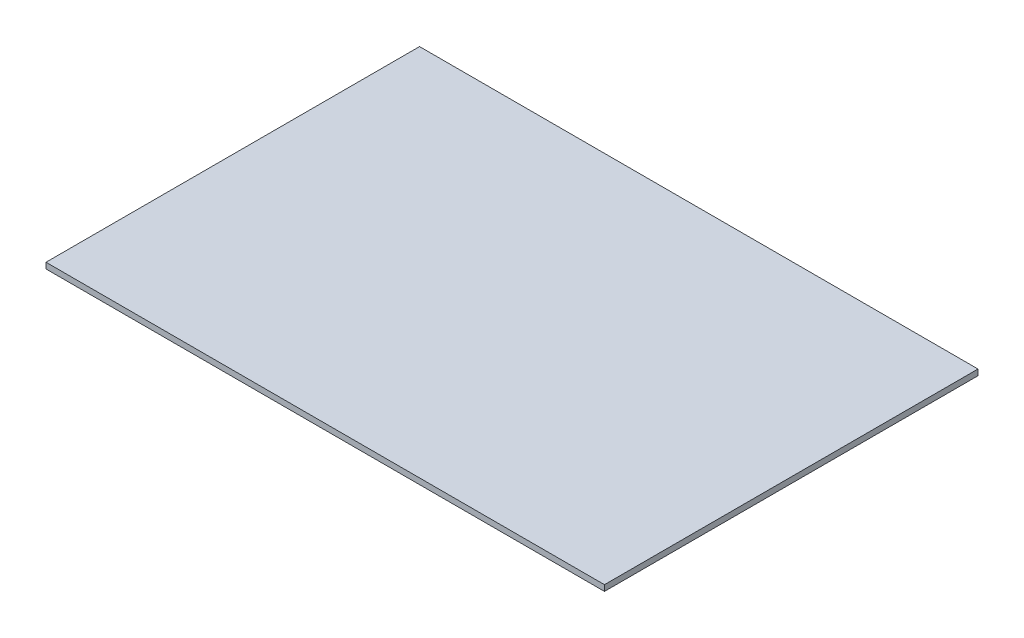
ISO-10303-21;
HEADER;
FILE_DESCRIPTION(('STEP AP214'),'2;1');
FILE_NAME('part.step','',(''),(''),'','','');
FILE_SCHEMA(('AUTOMOTIVE_DESIGN { 1 0 10303 214 1 1 1 1 }'));
ENDSEC;
DATA;
#1=APPLICATION_CONTEXT('core data for automotive mechanical design processes');
#2=APPLICATION_PROTOCOL_DEFINITION('international standard','automotive_design',2000,#1);
#3=PRODUCT_CONTEXT('',#1,'mechanical');
#4=PRODUCT('Part','Part','',(#3));
#5=PRODUCT_RELATED_PRODUCT_CATEGORY('part','',(#4));
#6=PRODUCT_DEFINITION_FORMATION('','',#4);
#7=PRODUCT_DEFINITION_CONTEXT('part definition',#1,'design');
#8=PRODUCT_DEFINITION('design','',#6,#7);
#9=PRODUCT_DEFINITION_SHAPE('','',#8);
#10=(LENGTH_UNIT() NAMED_UNIT(*) SI_UNIT(.MILLI.,.METRE.));
#11=(NAMED_UNIT(*) PLANE_ANGLE_UNIT() SI_UNIT($,.RADIAN.));
#12=(NAMED_UNIT(*) SI_UNIT($,.STERADIAN.) SOLID_ANGLE_UNIT());
#13=UNCERTAINTY_MEASURE_WITH_UNIT(LENGTH_MEASURE(1.E-05),#10,'distance_accuracy_value','');
#14=(GEOMETRIC_REPRESENTATION_CONTEXT(3) GLOBAL_UNCERTAINTY_ASSIGNED_CONTEXT((#13)) GLOBAL_UNIT_ASSIGNED_CONTEXT((#10,
#11,#12)) REPRESENTATION_CONTEXT('',''));
#15=CARTESIAN_POINT('',(0.,0.,0.));
#16=DIRECTION('',(0.,0.,1.));
#17=DIRECTION('',(1.,0.,0.));
#18=AXIS2_PLACEMENT_3D('',#15,#16,#17);
#19=CARTESIAN_POINT('',(76.25,1.6,51.));
#20=DIRECTION('',(-1.,0.,0.));
#21=DIRECTION('',(0.,0.,1.));
#22=AXIS2_PLACEMENT_3D('',#19,#20,#21);
#23=PLANE('',#22);
#24=DIRECTION('',(0.,0.,-1.));
#25=VECTOR('',#24,1.);
#26=CARTESIAN_POINT('',(76.25,0.,51.));
#27=LINE('',#26,#25);
#28=CARTESIAN_POINT('',(76.25,0.,51.));
#29=VERTEX_POINT('',#28);
#30=CARTESIAN_POINT('',(76.25,0.,-51.));
#31=VERTEX_POINT('',#30);
#32=EDGE_CURVE('E95',#29,#31,#27,.T.);
#33=ORIENTED_EDGE('',*,*,#32,.T.);
#34=DIRECTION('',(0.,-1.,0.));
#35=VECTOR('',#34,1.);
#36=CARTESIAN_POINT('',(76.25,1.6,-51.));
#37=LINE('',#36,#35);
#38=CARTESIAN_POINT('',(76.25,1.6,-51.));
#39=VERTEX_POINT('',#38);
#40=EDGE_CURVE('E11',#39,#31,#37,.T.);
#41=ORIENTED_EDGE('',*,*,#40,.F.);
#42=DIRECTION('',(0.,0.,-1.));
#43=VECTOR('',#42,1.);
#44=CARTESIAN_POINT('',(76.25,1.6,51.));
#45=LINE('',#44,#43);
#46=CARTESIAN_POINT('',(76.25,1.6,51.));
#47=VERTEX_POINT('',#46);
#48=EDGE_CURVE('E83',#47,#39,#45,.T.);
#49=ORIENTED_EDGE('',*,*,#48,.F.);
#50=DIRECTION('',(0.,-1.,0.));
#51=VECTOR('',#50,1.);
#52=CARTESIAN_POINT('',(76.25,1.6,51.));
#53=LINE('',#52,#51);
#54=EDGE_CURVE('E91',#47,#29,#53,.T.);
#55=ORIENTED_EDGE('',*,*,#54,.T.);
#56=EDGE_LOOP('',(#33,#41,#49,#55));
#57=FACE_BOUND('',#56,.T.);
#58=ADVANCED_FACE('F32',(#57),#23,.F.);
#59=CARTESIAN_POINT('',(-76.25,1.6,-51.));
#60=DIRECTION('',(0.,0.,1.));
#61=DIRECTION('',(1.,0.,0.));
#62=AXIS2_PLACEMENT_3D('',#59,#60,#61);
#63=PLANE('',#62);
#64=DIRECTION('',(-1.,0.,0.));
#65=VECTOR('',#64,1.);
#66=CARTESIAN_POINT('',(-76.25,0.,-51.));
#67=LINE('',#66,#65);
#68=CARTESIAN_POINT('',(-76.25,0.,-51.));
#69=VERTEX_POINT('',#68);
#70=EDGE_CURVE('E87',#31,#69,#67,.T.);
#71=ORIENTED_EDGE('',*,*,#70,.T.);
#72=DIRECTION('',(0.,-1.,0.));
#73=VECTOR('',#72,1.);
#74=CARTESIAN_POINT('',(-76.25,1.6,-51.));
#75=LINE('',#74,#73);
#76=CARTESIAN_POINT('',(-76.25,1.6,-51.));
#77=VERTEX_POINT('',#76);
#78=EDGE_CURVE('E40',#77,#69,#75,.T.);
#79=ORIENTED_EDGE('',*,*,#78,.F.);
#80=DIRECTION('',(-1.,0.,0.));
#81=VECTOR('',#80,1.);
#82=CARTESIAN_POINT('',(-76.25,1.6,-51.));
#83=LINE('',#82,#81);
#84=EDGE_CURVE('E78',#39,#77,#83,.T.);
#85=ORIENTED_EDGE('',*,*,#84,.F.);
#86=ORIENTED_EDGE('',*,*,#40,.T.);
#87=EDGE_LOOP('',(#71,#79,#85,#86));
#88=FACE_BOUND('',#87,.T.);
#89=ADVANCED_FACE('F86',(#88),#63,.F.);
#90=CARTESIAN_POINT('',(-76.25,1.6,51.));
#91=DIRECTION('',(1.,0.,0.));
#92=DIRECTION('',(0.,0.,-1.));
#93=AXIS2_PLACEMENT_3D('',#90,#91,#92);
#94=PLANE('',#93);
#95=DIRECTION('',(0.,0.,1.));
#96=VECTOR('',#95,1.);
#97=CARTESIAN_POINT('',(-76.25,0.,51.));
#98=LINE('',#97,#96);
#99=CARTESIAN_POINT('',(-76.25,0.,51.));
#100=VERTEX_POINT('',#99);
#101=EDGE_CURVE('E65',#69,#100,#98,.T.);
#102=ORIENTED_EDGE('',*,*,#101,.T.);
#103=DIRECTION('',(0.,-1.,0.));
#104=VECTOR('',#103,1.);
#105=CARTESIAN_POINT('',(-76.25,1.6,51.));
#106=LINE('',#105,#104);
#107=CARTESIAN_POINT('',(-76.25,1.6,51.));
#108=VERTEX_POINT('',#107);
#109=EDGE_CURVE('E88',#108,#100,#106,.T.);
#110=ORIENTED_EDGE('',*,*,#109,.F.);
#111=DIRECTION('',(0.,0.,1.));
#112=VECTOR('',#111,1.);
#113=CARTESIAN_POINT('',(-76.25,1.6,51.));
#114=LINE('',#113,#112);
#115=EDGE_CURVE('E81',#77,#108,#114,.T.);
#116=ORIENTED_EDGE('',*,*,#115,.F.);
#117=ORIENTED_EDGE('',*,*,#78,.T.);
#118=EDGE_LOOP('',(#102,#110,#116,#117));
#119=FACE_BOUND('',#118,.T.);
#120=ADVANCED_FACE('F89',(#119),#94,.F.);
#121=CARTESIAN_POINT('',(-76.25,1.6,51.));
#122=DIRECTION('',(0.,0.,-1.));
#123=DIRECTION('',(-1.,0.,0.));
#124=AXIS2_PLACEMENT_3D('',#121,#122,#123);
#125=PLANE('',#124);
#126=DIRECTION('',(1.,0.,0.));
#127=VECTOR('',#126,1.);
#128=CARTESIAN_POINT('',(-76.25,0.,51.));
#129=LINE('',#128,#127);
#130=EDGE_CURVE('E71',#100,#29,#129,.T.);
#131=ORIENTED_EDGE('',*,*,#130,.T.);
#132=ORIENTED_EDGE('',*,*,#54,.F.);
#133=DIRECTION('',(1.,0.,0.));
#134=VECTOR('',#133,1.);
#135=CARTESIAN_POINT('',(-76.25,1.6,51.));
#136=LINE('',#135,#134);
#137=EDGE_CURVE('E48',#108,#47,#136,.T.);
#138=ORIENTED_EDGE('',*,*,#137,.F.);
#139=ORIENTED_EDGE('',*,*,#109,.T.);
#140=EDGE_LOOP('',(#131,#132,#138,#139));
#141=FACE_BOUND('',#140,.T.);
#142=ADVANCED_FACE('F102',(#141),#125,.F.);
#143=CARTESIAN_POINT('',(0.,1.6,0.));
#144=DIRECTION('',(0.,-1.,0.));
#145=DIRECTION('',(0.,0.,-1.));
#146=AXIS2_PLACEMENT_3D('',#143,#144,#145);
#147=PLANE('',#146);
#148=ORIENTED_EDGE('',*,*,#48,.T.);
#149=ORIENTED_EDGE('',*,*,#84,.T.);
#150=ORIENTED_EDGE('',*,*,#115,.T.);
#151=ORIENTED_EDGE('',*,*,#137,.T.);
#152=EDGE_LOOP('',(#148,#149,#150,#151));
#153=FACE_BOUND('',#152,.T.);
#154=ADVANCED_FACE('F79',(#153),#147,.F.);
#155=CARTESIAN_POINT('',(0.,0.,0.));
#156=DIRECTION('',(0.,-1.,0.));
#157=DIRECTION('',(0.,0.,-1.));
#158=AXIS2_PLACEMENT_3D('',#155,#156,#157);
#159=PLANE('',#158);
#160=ORIENTED_EDGE('',*,*,#32,.F.);
#161=ORIENTED_EDGE('',*,*,#130,.F.);
#162=ORIENTED_EDGE('',*,*,#101,.F.);
#163=ORIENTED_EDGE('',*,*,#70,.F.);
#164=EDGE_LOOP('',(#160,#161,#162,#163));
#165=FACE_BOUND('',#164,.T.);
#166=ADVANCED_FACE('F105',(#165),#159,.T.);
#167=CLOSED_SHELL('',(#58,#89,#120,#142,#154,#166));
#168=MANIFOLD_SOLID_BREP('B2',#167);
#169=ADVANCED_BREP_SHAPE_REPRESENTATION('',(#18,#168),#14);
#170=SHAPE_DEFINITION_REPRESENTATION(#9,#169);
ENDSEC;
END-ISO-10303-21;
